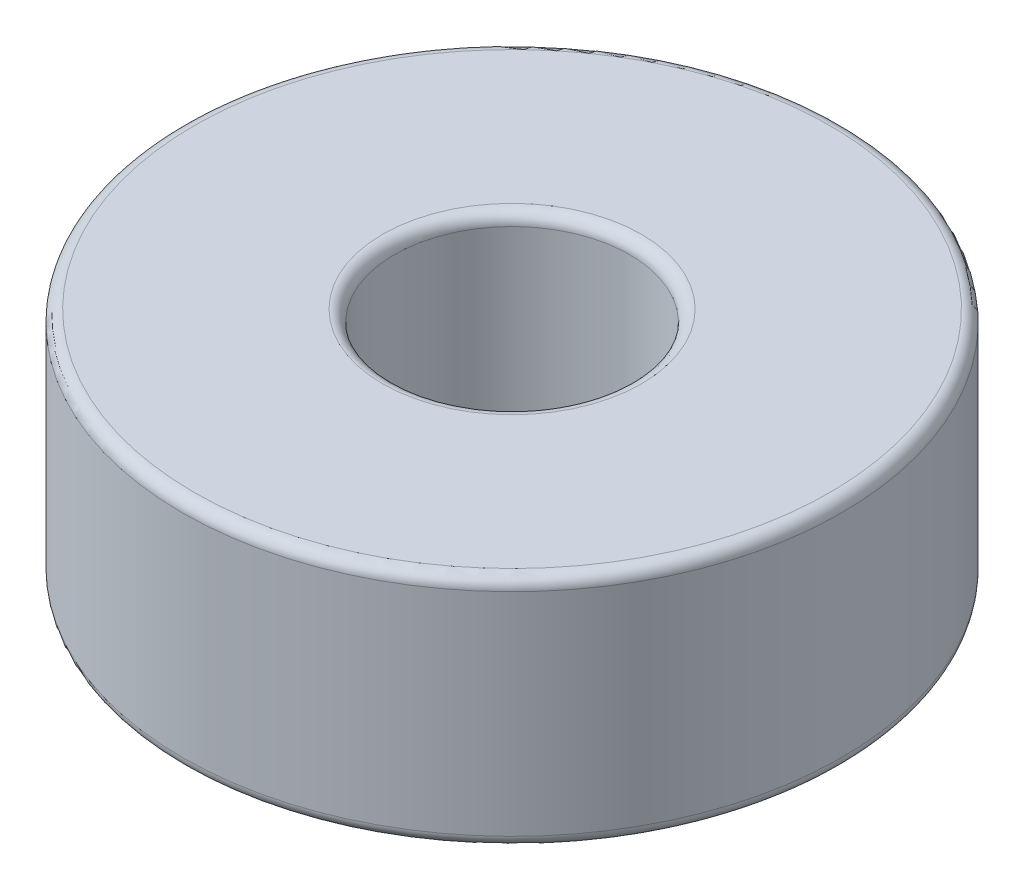
ISO-10303-21;
HEADER;
FILE_DESCRIPTION(('STEP AP214'),'2;1');
FILE_NAME('part.step','',(''),(''),'','','');
FILE_SCHEMA(('AUTOMOTIVE_DESIGN { 1 0 10303 214 1 1 1 1 }'));
ENDSEC;
DATA;
#1=APPLICATION_CONTEXT('core data for automotive mechanical design processes');
#2=APPLICATION_PROTOCOL_DEFINITION('international standard','automotive_design',2000,#1);
#3=PRODUCT_CONTEXT('',#1,'mechanical');
#4=PRODUCT('Part','Part','',(#3));
#5=PRODUCT_RELATED_PRODUCT_CATEGORY('part','',(#4));
#6=PRODUCT_DEFINITION_FORMATION('','',#4);
#7=PRODUCT_DEFINITION_CONTEXT('part definition',#1,'design');
#8=PRODUCT_DEFINITION('design','',#6,#7);
#9=PRODUCT_DEFINITION_SHAPE('','',#8);
#10=(LENGTH_UNIT() NAMED_UNIT(*) SI_UNIT(.MILLI.,.METRE.));
#11=(NAMED_UNIT(*) PLANE_ANGLE_UNIT() SI_UNIT($,.RADIAN.));
#12=(NAMED_UNIT(*) SI_UNIT($,.STERADIAN.) SOLID_ANGLE_UNIT());
#13=UNCERTAINTY_MEASURE_WITH_UNIT(LENGTH_MEASURE(1.E-05),#10,'distance_accuracy_value','');
#14=(GEOMETRIC_REPRESENTATION_CONTEXT(3) GLOBAL_UNCERTAINTY_ASSIGNED_CONTEXT((#13)) GLOBAL_UNIT_ASSIGNED_CONTEXT((#10,
#11,#12)) REPRESENTATION_CONTEXT('',''));
#15=CARTESIAN_POINT('',(0.,0.,0.));
#16=DIRECTION('',(0.,0.,1.));
#17=DIRECTION('',(1.,0.,0.));
#18=AXIS2_PLACEMENT_3D('',#15,#16,#17);
#19=CARTESIAN_POINT('',(0.,5.,0.));
#20=DIRECTION('',(0.,1.,0.));
#21=DIRECTION('',(0.,0.,1.));
#22=AXIS2_PLACEMENT_3D('',#19,#20,#21);
#23=PLANE('',#22);
#24=CARTESIAN_POINT('',(0.,5.,0.));
#25=DIRECTION('',(0.,1.,0.));
#26=DIRECTION('',(0.,0.,1.));
#27=AXIS2_PLACEMENT_3D('',#24,#25,#26);
#28=CIRCLE('',#27,2.75);
#29=CARTESIAN_POINT('',(0.,5.,2.75));
#30=VERTEX_POINT('',#29);
#31=EDGE_CURVE('E43',#30,#30,#28,.F.);
#32=ORIENTED_EDGE('',*,*,#31,.T.);
#33=EDGE_LOOP('',(#32));
#34=FACE_BOUND('',#33,.T.);
#35=CARTESIAN_POINT('',(0.,5.,0.));
#36=DIRECTION('',(0.,1.,0.));
#37=DIRECTION('',(0.,0.,1.));
#38=AXIS2_PLACEMENT_3D('',#35,#36,#37);
#39=CIRCLE('',#38,6.75);
#40=CARTESIAN_POINT('',(0.,5.,6.75));
#41=VERTEX_POINT('',#40);
#42=EDGE_CURVE('E47',#41,#41,#39,.T.);
#43=ORIENTED_EDGE('',*,*,#42,.T.);
#44=EDGE_LOOP('',(#43));
#45=FACE_BOUND('',#44,.T.);
#46=ADVANCED_FACE('F32',(#34,#45),#23,.T.);
#47=CARTESIAN_POINT('',(0.,0.,0.));
#48=DIRECTION('',(0.,1.,0.));
#49=DIRECTION('',(0.,0.,1.));
#50=AXIS2_PLACEMENT_3D('',#47,#48,#49);
#51=PLANE('',#50);
#52=CARTESIAN_POINT('',(0.,0.,0.));
#53=DIRECTION('',(0.,1.,0.));
#54=DIRECTION('',(0.,0.,1.));
#55=AXIS2_PLACEMENT_3D('',#52,#53,#54);
#56=CIRCLE('',#55,2.75);
#57=CARTESIAN_POINT('',(0.,0.,2.75));
#58=VERTEX_POINT('',#57);
#59=EDGE_CURVE('E58',#58,#58,#56,.T.);
#60=ORIENTED_EDGE('',*,*,#59,.T.);
#61=EDGE_LOOP('',(#60));
#62=FACE_BOUND('',#61,.T.);
#63=CARTESIAN_POINT('',(0.,0.,0.));
#64=DIRECTION('',(0.,1.,0.));
#65=DIRECTION('',(0.,0.,1.));
#66=AXIS2_PLACEMENT_3D('',#63,#64,#65);
#67=CIRCLE('',#66,6.75);
#68=CARTESIAN_POINT('',(0.,0.,6.75));
#69=VERTEX_POINT('',#68);
#70=EDGE_CURVE('E61',#69,#69,#67,.F.);
#71=ORIENTED_EDGE('',*,*,#70,.T.);
#72=EDGE_LOOP('',(#71));
#73=FACE_BOUND('',#72,.T.);
#74=ADVANCED_FACE('F65',(#62,#73),#51,.F.);
#75=CARTESIAN_POINT('',(0.,5.,0.));
#76=DIRECTION('',(0.,-1.,0.));
#77=DIRECTION('',(0.,0.,-1.));
#78=AXIS2_PLACEMENT_3D('',#75,#76,#77);
#79=CYLINDRICAL_SURFACE('',#78,7.);
#80=CARTESIAN_POINT('',(0.,0.25,0.));
#81=DIRECTION('',(0.,1.,0.));
#82=DIRECTION('',(0.,0.,1.));
#83=AXIS2_PLACEMENT_3D('',#80,#81,#82);
#84=CIRCLE('',#83,7.);
#85=CARTESIAN_POINT('',(0.,0.25,7.));
#86=VERTEX_POINT('',#85);
#87=EDGE_CURVE('E10',#86,#86,#84,.T.);
#88=ORIENTED_EDGE('',*,*,#87,.T.);
#89=EDGE_LOOP('',(#88));
#90=FACE_BOUND('',#89,.T.);
#91=CARTESIAN_POINT('',(0.,4.75,0.));
#92=DIRECTION('',(0.,1.,0.));
#93=DIRECTION('',(0.,0.,1.));
#94=AXIS2_PLACEMENT_3D('',#91,#92,#93);
#95=CIRCLE('',#94,7.);
#96=CARTESIAN_POINT('',(0.,4.75,7.));
#97=VERTEX_POINT('',#96);
#98=EDGE_CURVE('E39',#97,#97,#95,.F.);
#99=ORIENTED_EDGE('',*,*,#98,.T.);
#100=EDGE_LOOP('',(#99));
#101=FACE_BOUND('',#100,.T.);
#102=ADVANCED_FACE('F85',(#90,#101),#79,.T.);
#103=CARTESIAN_POINT('',(0.,5.,0.));
#104=DIRECTION('',(0.,-1.,0.));
#105=DIRECTION('',(0.,0.,-1.));
#106=AXIS2_PLACEMENT_3D('',#103,#104,#105);
#107=CYLINDRICAL_SURFACE('',#106,2.5);
#108=CARTESIAN_POINT('',(0.,0.25,0.));
#109=DIRECTION('',(0.,1.,0.));
#110=DIRECTION('',(0.,0.,1.));
#111=AXIS2_PLACEMENT_3D('',#108,#109,#110);
#112=CIRCLE('',#111,2.5);
#113=CARTESIAN_POINT('',(0.,0.25,2.5));
#114=VERTEX_POINT('',#113);
#115=EDGE_CURVE('E52',#114,#114,#112,.F.);
#116=ORIENTED_EDGE('',*,*,#115,.T.);
#117=EDGE_LOOP('',(#116));
#118=FACE_BOUND('',#117,.T.);
#119=CARTESIAN_POINT('',(0.,4.75,0.));
#120=DIRECTION('',(0.,1.,0.));
#121=DIRECTION('',(0.,0.,1.));
#122=AXIS2_PLACEMENT_3D('',#119,#120,#121);
#123=CIRCLE('',#122,2.5);
#124=CARTESIAN_POINT('',(0.,4.75,2.5));
#125=VERTEX_POINT('',#124);
#126=EDGE_CURVE('E55',#125,#125,#123,.T.);
#127=ORIENTED_EDGE('',*,*,#126,.T.);
#128=EDGE_LOOP('',(#127));
#129=FACE_BOUND('',#128,.T.);
#130=ADVANCED_FACE('F90',(#118,#129),#107,.F.);
#131=CARTESIAN_POINT('',(0.,0.25,0.));
#132=DIRECTION('',(0.,1.,0.));
#133=DIRECTION('',(0.,0.,1.));
#134=AXIS2_PLACEMENT_3D('',#131,#132,#133);
#135=TOROIDAL_SURFACE('',#134,2.75,0.25);
#136=ORIENTED_EDGE('',*,*,#115,.F.);
#137=EDGE_LOOP('',(#136));
#138=FACE_BOUND('',#137,.T.);
#139=ORIENTED_EDGE('',*,*,#59,.F.);
#140=EDGE_LOOP('',(#139));
#141=FACE_BOUND('',#140,.T.);
#142=ADVANCED_FACE('F76',(#138,#141),#135,.T.);
#143=CARTESIAN_POINT('',(0.,4.75,0.));
#144=DIRECTION('',(0.,1.,0.));
#145=DIRECTION('',(0.,0.,1.));
#146=AXIS2_PLACEMENT_3D('',#143,#144,#145);
#147=TOROIDAL_SURFACE('',#146,2.75,0.25);
#148=ORIENTED_EDGE('',*,*,#31,.F.);
#149=EDGE_LOOP('',(#148));
#150=FACE_BOUND('',#149,.T.);
#151=ORIENTED_EDGE('',*,*,#126,.F.);
#152=EDGE_LOOP('',(#151));
#153=FACE_BOUND('',#152,.T.);
#154=ADVANCED_FACE('F70',(#150,#153),#147,.T.);
#155=CARTESIAN_POINT('',(0.,0.25,0.));
#156=DIRECTION('',(0.,1.,0.));
#157=DIRECTION('',(0.,0.,1.));
#158=AXIS2_PLACEMENT_3D('',#155,#156,#157);
#159=TOROIDAL_SURFACE('',#158,6.75,0.25);
#160=ORIENTED_EDGE('',*,*,#70,.F.);
#161=EDGE_LOOP('',(#160));
#162=FACE_BOUND('',#161,.T.);
#163=ORIENTED_EDGE('',*,*,#87,.F.);
#164=EDGE_LOOP('',(#163));
#165=FACE_BOUND('',#164,.T.);
#166=ADVANCED_FACE('F67',(#162,#165),#159,.T.);
#167=CARTESIAN_POINT('',(0.,4.75,0.));
#168=DIRECTION('',(0.,1.,0.));
#169=DIRECTION('',(0.,0.,1.));
#170=AXIS2_PLACEMENT_3D('',#167,#168,#169);
#171=TOROIDAL_SURFACE('',#170,6.75,0.25);
#172=ORIENTED_EDGE('',*,*,#98,.F.);
#173=EDGE_LOOP('',(#172));
#174=FACE_BOUND('',#173,.T.);
#175=ORIENTED_EDGE('',*,*,#42,.F.);
#176=EDGE_LOOP('',(#175));
#177=FACE_BOUND('',#176,.T.);
#178=ADVANCED_FACE('F34',(#174,#177),#171,.T.);
#179=CLOSED_SHELL('',(#46,#74,#102,#130,#142,#154,#166,#178));
#180=MANIFOLD_SOLID_BREP('B2',#179);
#181=ADVANCED_BREP_SHAPE_REPRESENTATION('',(#18,#180),#14);
#182=SHAPE_DEFINITION_REPRESENTATION(#9,#181);
ENDSEC;
END-ISO-10303-21;
